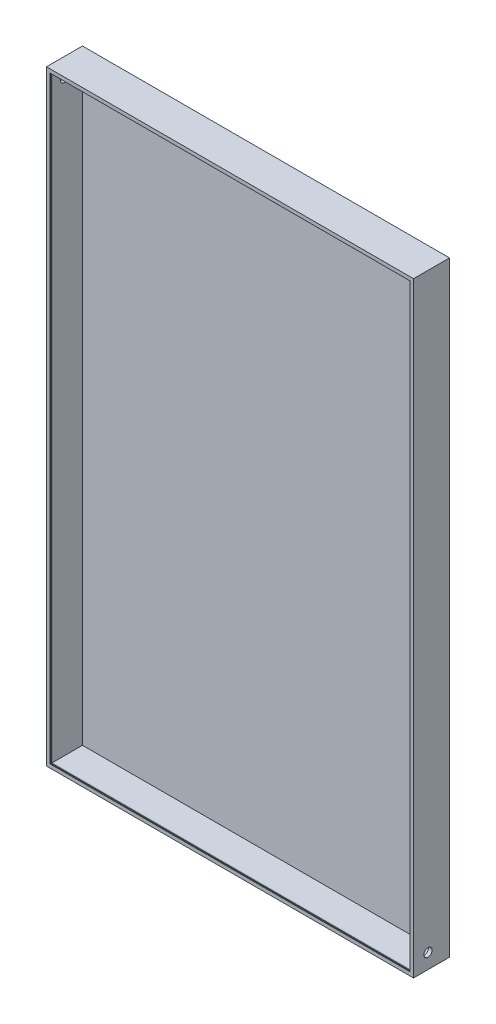
ISO-10303-21;
HEADER;
FILE_DESCRIPTION(('STEP AP214'),'2;1');
FILE_NAME('part.step','',(''),(''),'','','');
FILE_SCHEMA(('AUTOMOTIVE_DESIGN { 1 0 10303 214 1 1 1 1 }'));
ENDSEC;
DATA;
#1=APPLICATION_CONTEXT('core data for automotive mechanical design processes');
#2=APPLICATION_PROTOCOL_DEFINITION('international standard','automotive_design',2000,#1);
#3=PRODUCT_CONTEXT('',#1,'mechanical');
#4=PRODUCT('Part','Part','',(#3));
#5=PRODUCT_RELATED_PRODUCT_CATEGORY('part','',(#4));
#6=PRODUCT_DEFINITION_FORMATION('','',#4);
#7=PRODUCT_DEFINITION_CONTEXT('part definition',#1,'design');
#8=PRODUCT_DEFINITION('design','',#6,#7);
#9=PRODUCT_DEFINITION_SHAPE('','',#8);
#10=(LENGTH_UNIT() NAMED_UNIT(*) SI_UNIT(.MILLI.,.METRE.));
#11=(NAMED_UNIT(*) PLANE_ANGLE_UNIT() SI_UNIT($,.RADIAN.));
#12=(NAMED_UNIT(*) SI_UNIT($,.STERADIAN.) SOLID_ANGLE_UNIT());
#13=UNCERTAINTY_MEASURE_WITH_UNIT(LENGTH_MEASURE(1.E-05),#10,'distance_accuracy_value','');
#14=(GEOMETRIC_REPRESENTATION_CONTEXT(3) GLOBAL_UNCERTAINTY_ASSIGNED_CONTEXT((#13)) GLOBAL_UNIT_ASSIGNED_CONTEXT((#10,
#11,#12)) REPRESENTATION_CONTEXT('',''));
#15=CARTESIAN_POINT('',(0.,0.,0.));
#16=DIRECTION('',(0.,0.,1.));
#17=DIRECTION('',(1.,0.,0.));
#18=AXIS2_PLACEMENT_3D('',#15,#16,#17);
#19=CARTESIAN_POINT('',(0.,0.,100.));
#20=DIRECTION('',(1.,0.,0.));
#21=DIRECTION('',(0.,0.,-1.));
#22=AXIS2_PLACEMENT_3D('',#19,#20,#21);
#23=PLANE('',#22);
#24=CARTESIAN_POINT('',(0.,1631.45,60.));
#25=DIRECTION('',(1.,0.,0.));
#26=DIRECTION('',(0.,0.,-1.));
#27=AXIS2_PLACEMENT_3D('',#24,#25,#26);
#28=CIRCLE('',#27,11.45);
#29=CARTESIAN_POINT('',(0.,1631.45,48.55));
#30=VERTEX_POINT('',#29);
#31=EDGE_CURVE('E226',#30,#30,#28,.F.);
#32=ORIENTED_EDGE('',*,*,#31,.T.);
#33=EDGE_LOOP('',(#32));
#34=FACE_BOUND('',#33,.T.);
#35=DIRECTION('',(0.,0.,-1.));
#36=VECTOR('',#35,1.);
#37=CARTESIAN_POINT('',(0.,1662.9,100.));
#38=LINE('',#37,#36);
#39=CARTESIAN_POINT('',(0.,1662.9,96.));
#40=VERTEX_POINT('',#39);
#41=CARTESIAN_POINT('',(0.,1662.9,10.));
#42=VERTEX_POINT('',#41);
#43=EDGE_CURVE('E243',#40,#42,#38,.T.);
#44=ORIENTED_EDGE('',*,*,#43,.F.);
#45=DIRECTION('',(0.,-1.,0.));
#46=VECTOR('',#45,1.);
#47=CARTESIAN_POINT('',(0.,1662.9,96.));
#48=LINE('',#47,#46);
#49=CARTESIAN_POINT('',(0.,0.,96.));
#50=VERTEX_POINT('',#49);
#51=EDGE_CURVE('E203',#40,#50,#48,.T.);
#52=ORIENTED_EDGE('',*,*,#51,.T.);
#53=DIRECTION('',(0.,0.,-1.));
#54=VECTOR('',#53,1.);
#55=CARTESIAN_POINT('',(0.,0.,100.));
#56=LINE('',#55,#54);
#57=CARTESIAN_POINT('',(0.,0.,10.));
#58=VERTEX_POINT('',#57);
#59=EDGE_CURVE('E252',#50,#58,#56,.T.);
#60=ORIENTED_EDGE('',*,*,#59,.T.);
#61=DIRECTION('',(0.,-1.,0.));
#62=VECTOR('',#61,1.);
#63=CARTESIAN_POINT('',(0.,0.,10.));
#64=LINE('',#63,#62);
#65=EDGE_CURVE('E11',#42,#58,#64,.T.);
#66=ORIENTED_EDGE('',*,*,#65,.F.);
#67=EDGE_LOOP('',(#44,#52,#60,#66));
#68=FACE_BOUND('',#67,.T.);
#69=ADVANCED_FACE('F43',(#34,#68),#23,.T.);
#70=CARTESIAN_POINT('',(1000.,0.,100.));
#71=DIRECTION('',(0.,1.,0.));
#72=DIRECTION('',(0.,0.,1.));
#73=AXIS2_PLACEMENT_3D('',#70,#71,#72);
#74=PLANE('',#73);
#75=ORIENTED_EDGE('',*,*,#59,.F.);
#76=DIRECTION('',(1.,0.,0.));
#77=VECTOR('',#76,1.);
#78=CARTESIAN_POINT('',(0.,0.,96.));
#79=LINE('',#78,#77);
#80=CARTESIAN_POINT('',(1000.,0.,96.));
#81=VERTEX_POINT('',#80);
#82=EDGE_CURVE('E206',#50,#81,#79,.T.);
#83=ORIENTED_EDGE('',*,*,#82,.T.);
#84=DIRECTION('',(0.,0.,-1.));
#85=VECTOR('',#84,1.);
#86=CARTESIAN_POINT('',(1000.,0.,100.));
#87=LINE('',#86,#85);
#88=CARTESIAN_POINT('',(1000.,0.,10.));
#89=VERTEX_POINT('',#88);
#90=EDGE_CURVE('E249',#81,#89,#87,.T.);
#91=ORIENTED_EDGE('',*,*,#90,.T.);
#92=DIRECTION('',(1.,0.,0.));
#93=VECTOR('',#92,1.);
#94=CARTESIAN_POINT('',(0.,0.,10.));
#95=LINE('',#94,#93);
#96=EDGE_CURVE('E285',#58,#89,#95,.T.);
#97=ORIENTED_EDGE('',*,*,#96,.F.);
#98=EDGE_LOOP('',(#75,#83,#91,#97));
#99=FACE_BOUND('',#98,.T.);
#100=ADVANCED_FACE('F304',(#99),#74,.T.);
#101=CARTESIAN_POINT('',(1000.,1662.9,100.));
#102=DIRECTION('',(-1.,0.,0.));
#103=DIRECTION('',(0.,0.,1.));
#104=AXIS2_PLACEMENT_3D('',#101,#102,#103);
#105=PLANE('',#104);
#106=CARTESIAN_POINT('',(1000.,31.47,60.));
#107=DIRECTION('',(1.,0.,0.));
#108=DIRECTION('',(0.,1.,0.));
#109=AXIS2_PLACEMENT_3D('',#106,#107,#108);
#110=CIRCLE('',#109,11.45);
#111=CARTESIAN_POINT('',(1000.,42.92,60.));
#112=VERTEX_POINT('',#111);
#113=EDGE_CURVE('E223',#112,#112,#110,.T.);
#114=ORIENTED_EDGE('',*,*,#113,.T.);
#115=EDGE_LOOP('',(#114));
#116=FACE_BOUND('',#115,.T.);
#117=ORIENTED_EDGE('',*,*,#90,.F.);
#118=DIRECTION('',(0.,1.,0.));
#119=VECTOR('',#118,1.);
#120=CARTESIAN_POINT('',(1000.,1662.9,96.));
#121=LINE('',#120,#119);
#122=CARTESIAN_POINT('',(1000.,1662.9,96.));
#123=VERTEX_POINT('',#122);
#124=EDGE_CURVE('E210',#81,#123,#121,.T.);
#125=ORIENTED_EDGE('',*,*,#124,.T.);
#126=DIRECTION('',(0.,0.,-1.));
#127=VECTOR('',#126,1.);
#128=CARTESIAN_POINT('',(1000.,1662.9,100.));
#129=LINE('',#128,#127);
#130=CARTESIAN_POINT('',(1000.,1662.9,10.));
#131=VERTEX_POINT('',#130);
#132=EDGE_CURVE('E246',#123,#131,#129,.T.);
#133=ORIENTED_EDGE('',*,*,#132,.T.);
#134=DIRECTION('',(0.,1.,0.));
#135=VECTOR('',#134,1.);
#136=CARTESIAN_POINT('',(1000.,0.,10.));
#137=LINE('',#136,#135);
#138=EDGE_CURVE('E288',#89,#131,#137,.T.);
#139=ORIENTED_EDGE('',*,*,#138,.F.);
#140=EDGE_LOOP('',(#117,#125,#133,#139));
#141=FACE_BOUND('',#140,.T.);
#142=ADVANCED_FACE('F307',(#116,#141),#105,.T.);
#143=CARTESIAN_POINT('',(0.,1662.9,100.));
#144=DIRECTION('',(0.,-1.,0.));
#145=DIRECTION('',(0.,0.,-1.));
#146=AXIS2_PLACEMENT_3D('',#143,#144,#145);
#147=PLANE('',#146);
#148=ORIENTED_EDGE('',*,*,#132,.F.);
#149=DIRECTION('',(-1.,0.,0.));
#150=VECTOR('',#149,1.);
#151=CARTESIAN_POINT('',(0.,1662.9,96.));
#152=LINE('',#151,#150);
#153=EDGE_CURVE('E213',#123,#40,#152,.T.);
#154=ORIENTED_EDGE('',*,*,#153,.T.);
#155=ORIENTED_EDGE('',*,*,#43,.T.);
#156=DIRECTION('',(-1.,0.,0.));
#157=VECTOR('',#156,1.);
#158=CARTESIAN_POINT('',(1000.,1662.9,10.));
#159=LINE('',#158,#157);
#160=EDGE_CURVE('E51',#131,#42,#159,.T.);
#161=ORIENTED_EDGE('',*,*,#160,.F.);
#162=EDGE_LOOP('',(#148,#154,#155,#161));
#163=FACE_BOUND('',#162,.T.);
#164=ADVANCED_FACE('F298',(#163),#147,.T.);
#165=CARTESIAN_POINT('',(0.,0.,10.));
#166=DIRECTION('',(0.,0.,1.));
#167=DIRECTION('',(1.,0.,0.));
#168=AXIS2_PLACEMENT_3D('',#165,#166,#167);
#169=PLANE('',#168);
#170=ORIENTED_EDGE('',*,*,#96,.T.);
#171=ORIENTED_EDGE('',*,*,#138,.T.);
#172=ORIENTED_EDGE('',*,*,#160,.T.);
#173=ORIENTED_EDGE('',*,*,#65,.T.);
#174=EDGE_LOOP('',(#170,#171,#172,#173));
#175=FACE_BOUND('',#174,.T.);
#176=ADVANCED_FACE('F293',(#175),#169,.T.);
#177=CARTESIAN_POINT('',(0.,0.,100.));
#178=DIRECTION('',(0.,0.,-1.));
#179=DIRECTION('',(-1.,0.,0.));
#180=AXIS2_PLACEMENT_3D('',#177,#178,#179);
#181=PLANE('',#180);
#182=DIRECTION('',(0.,1.,0.));
#183=VECTOR('',#182,1.);
#184=CARTESIAN_POINT('',(1010.,1672.9,100.));
#185=LINE('',#184,#183);
#186=CARTESIAN_POINT('',(1010.,-9.99999999999999,100.));
#187=VERTEX_POINT('',#186);
#188=CARTESIAN_POINT('',(1010.,1672.9,100.));
#189=VERTEX_POINT('',#188);
#190=EDGE_CURVE('E256',#187,#189,#185,.T.);
#191=ORIENTED_EDGE('',*,*,#190,.T.);
#192=DIRECTION('',(-1.,0.,0.));
#193=VECTOR('',#192,1.);
#194=CARTESIAN_POINT('',(-9.99999999999999,1672.9,100.));
#195=LINE('',#194,#193);
#196=CARTESIAN_POINT('',(-9.99999999999999,1672.9,100.));
#197=VERTEX_POINT('',#196);
#198=EDGE_CURVE('E259',#189,#197,#195,.T.);
#199=ORIENTED_EDGE('',*,*,#198,.T.);
#200=DIRECTION('',(0.,-1.,0.));
#201=VECTOR('',#200,1.);
#202=CARTESIAN_POINT('',(-10.,-10.0000000000001,100.));
#203=LINE('',#202,#201);
#204=CARTESIAN_POINT('',(-10.,-10.0000000000001,100.));
#205=VERTEX_POINT('',#204);
#206=EDGE_CURVE('E262',#197,#205,#203,.T.);
#207=ORIENTED_EDGE('',*,*,#206,.T.);
#208=DIRECTION('',(1.,0.,0.));
#209=VECTOR('',#208,1.);
#210=CARTESIAN_POINT('',(1010.,-9.99999999999999,100.));
#211=LINE('',#210,#209);
#212=EDGE_CURVE('E264',#205,#187,#211,.T.);
#213=ORIENTED_EDGE('',*,*,#212,.T.);
#214=EDGE_LOOP('',(#191,#199,#207,#213));
#215=FACE_BOUND('',#214,.T.);
#216=DIRECTION('',(0.,-1.,0.));
#217=VECTOR('',#216,1.);
#218=CARTESIAN_POINT('',(0.,0.,100.));
#219=LINE('',#218,#217);
#220=CARTESIAN_POINT('',(0.,1662.9,100.));
#221=VERTEX_POINT('',#220);
#222=CARTESIAN_POINT('',(0.,0.,100.));
#223=VERTEX_POINT('',#222);
#224=EDGE_CURVE('E234',#221,#223,#219,.T.);
#225=ORIENTED_EDGE('',*,*,#224,.F.);
#226=DIRECTION('',(-1.,0.,0.));
#227=VECTOR('',#226,1.);
#228=CARTESIAN_POINT('',(0.,1662.9,100.));
#229=LINE('',#228,#227);
#230=CARTESIAN_POINT('',(1000.,1662.9,100.));
#231=VERTEX_POINT('',#230);
#232=EDGE_CURVE('E241',#231,#221,#229,.T.);
#233=ORIENTED_EDGE('',*,*,#232,.F.);
#234=DIRECTION('',(0.,1.,0.));
#235=VECTOR('',#234,1.);
#236=CARTESIAN_POINT('',(1000.,1662.9,100.));
#237=LINE('',#236,#235);
#238=CARTESIAN_POINT('',(1000.,0.,100.));
#239=VERTEX_POINT('',#238);
#240=EDGE_CURVE('E238',#239,#231,#237,.T.);
#241=ORIENTED_EDGE('',*,*,#240,.F.);
#242=DIRECTION('',(1.,0.,0.));
#243=VECTOR('',#242,1.);
#244=CARTESIAN_POINT('',(1000.,0.,100.));
#245=LINE('',#244,#243);
#246=EDGE_CURVE('E236',#223,#239,#245,.T.);
#247=ORIENTED_EDGE('',*,*,#246,.F.);
#248=EDGE_LOOP('',(#225,#233,#241,#247));
#249=FACE_BOUND('',#248,.T.);
#250=ADVANCED_FACE('F353',(#215,#249),#181,.F.);
#251=CARTESIAN_POINT('',(1010.,1672.9,100.));
#252=DIRECTION('',(-1.,0.,0.));
#253=DIRECTION('',(0.,-1.,0.));
#254=AXIS2_PLACEMENT_3D('',#251,#252,#253);
#255=PLANE('',#254);
#256=CARTESIAN_POINT('',(1010.,31.47,60.));
#257=DIRECTION('',(1.,0.,0.));
#258=DIRECTION('',(0.,1.,0.));
#259=AXIS2_PLACEMENT_3D('',#256,#257,#258);
#260=CIRCLE('',#259,11.45);
#261=CARTESIAN_POINT('',(1010.,42.92,60.));
#262=VERTEX_POINT('',#261);
#263=EDGE_CURVE('E216',#262,#262,#260,.T.);
#264=ORIENTED_EDGE('',*,*,#263,.F.);
#265=EDGE_LOOP('',(#264));
#266=FACE_BOUND('',#265,.T.);
#267=DIRECTION('',(0.,1.,0.));
#268=VECTOR('',#267,1.);
#269=CARTESIAN_POINT('',(1010.,1672.9,0.));
#270=LINE('',#269,#268);
#271=CARTESIAN_POINT('',(1010.,-9.99999999999999,0.));
#272=VERTEX_POINT('',#271);
#273=CARTESIAN_POINT('',(1010.,1672.9,0.));
#274=VERTEX_POINT('',#273);
#275=EDGE_CURVE('E255',#272,#274,#270,.T.);
#276=ORIENTED_EDGE('',*,*,#275,.T.);
#277=DIRECTION('',(0.,0.,-1.));
#278=VECTOR('',#277,1.);
#279=CARTESIAN_POINT('',(1010.,1672.9,100.));
#280=LINE('',#279,#278);
#281=EDGE_CURVE('E282',#189,#274,#280,.T.);
#282=ORIENTED_EDGE('',*,*,#281,.F.);
#283=ORIENTED_EDGE('',*,*,#190,.F.);
#284=DIRECTION('',(0.,0.,-1.));
#285=VECTOR('',#284,1.);
#286=CARTESIAN_POINT('',(1010.,-9.99999999999999,100.));
#287=LINE('',#286,#285);
#288=EDGE_CURVE('E266',#187,#272,#287,.T.);
#289=ORIENTED_EDGE('',*,*,#288,.T.);
#290=EDGE_LOOP('',(#276,#282,#283,#289));
#291=FACE_BOUND('',#290,.T.);
#292=ADVANCED_FACE('F355',(#266,#291),#255,.F.);
#293=CARTESIAN_POINT('',(-9.99999999999999,1672.9,100.));
#294=DIRECTION('',(0.,-1.,0.));
#295=DIRECTION('',(0.,0.,-1.));
#296=AXIS2_PLACEMENT_3D('',#293,#294,#295);
#297=PLANE('',#296);
#298=DIRECTION('',(-1.,0.,0.));
#299=VECTOR('',#298,1.);
#300=CARTESIAN_POINT('',(-9.99999999999999,1672.9,0.));
#301=LINE('',#300,#299);
#302=CARTESIAN_POINT('',(-9.99999999999999,1672.9,0.));
#303=VERTEX_POINT('',#302);
#304=EDGE_CURVE('E269',#274,#303,#301,.T.);
#305=ORIENTED_EDGE('',*,*,#304,.T.);
#306=DIRECTION('',(0.,0.,-1.));
#307=VECTOR('',#306,1.);
#308=CARTESIAN_POINT('',(-9.99999999999999,1672.9,100.));
#309=LINE('',#308,#307);
#310=EDGE_CURVE('E279',#197,#303,#309,.T.);
#311=ORIENTED_EDGE('',*,*,#310,.F.);
#312=ORIENTED_EDGE('',*,*,#198,.F.);
#313=ORIENTED_EDGE('',*,*,#281,.T.);
#314=EDGE_LOOP('',(#305,#311,#312,#313));
#315=FACE_BOUND('',#314,.T.);
#316=ADVANCED_FACE('F361',(#315),#297,.F.);
#317=CARTESIAN_POINT('',(-10.,-10.0000000000001,100.));
#318=DIRECTION('',(1.,0.,0.));
#319=DIRECTION('',(0.,1.,0.));
#320=AXIS2_PLACEMENT_3D('',#317,#318,#319);
#321=PLANE('',#320);
#322=CARTESIAN_POINT('',(-9.99999999999999,1631.45,60.));
#323=DIRECTION('',(-1.,0.,0.));
#324=DIRECTION('',(0.,-1.,0.));
#325=AXIS2_PLACEMENT_3D('',#322,#323,#324);
#326=CIRCLE('',#325,11.45);
#327=CARTESIAN_POINT('',(-9.99999999999999,1620.,60.));
#328=VERTEX_POINT('',#327);
#329=EDGE_CURVE('E231',#328,#328,#326,.T.);
#330=ORIENTED_EDGE('',*,*,#329,.F.);
#331=EDGE_LOOP('',(#330));
#332=FACE_BOUND('',#331,.T.);
#333=DIRECTION('',(0.,-1.,0.));
#334=VECTOR('',#333,1.);
#335=CARTESIAN_POINT('',(-10.,-10.0000000000001,0.));
#336=LINE('',#335,#334);
#337=CARTESIAN_POINT('',(-10.,-10.0000000000001,0.));
#338=VERTEX_POINT('',#337);
#339=EDGE_CURVE('E271',#303,#338,#336,.T.);
#340=ORIENTED_EDGE('',*,*,#339,.T.);
#341=DIRECTION('',(0.,0.,-1.));
#342=VECTOR('',#341,1.);
#343=CARTESIAN_POINT('',(-10.,-10.0000000000001,100.));
#344=LINE('',#343,#342);
#345=EDGE_CURVE('E276',#205,#338,#344,.T.);
#346=ORIENTED_EDGE('',*,*,#345,.F.);
#347=ORIENTED_EDGE('',*,*,#206,.F.);
#348=ORIENTED_EDGE('',*,*,#310,.T.);
#349=EDGE_LOOP('',(#340,#346,#347,#348));
#350=FACE_BOUND('',#349,.T.);
#351=ADVANCED_FACE('F340',(#332,#350),#321,.F.);
#352=CARTESIAN_POINT('',(1010.,-9.99999999999999,100.));
#353=DIRECTION('',(0.,1.,0.));
#354=DIRECTION('',(-1.,0.,0.));
#355=AXIS2_PLACEMENT_3D('',#352,#353,#354);
#356=PLANE('',#355);
#357=DIRECTION('',(1.,0.,0.));
#358=VECTOR('',#357,1.);
#359=CARTESIAN_POINT('',(1010.,-9.99999999999999,0.));
#360=LINE('',#359,#358);
#361=EDGE_CURVE('E260',#338,#272,#360,.T.);
#362=ORIENTED_EDGE('',*,*,#361,.T.);
#363=ORIENTED_EDGE('',*,*,#288,.F.);
#364=ORIENTED_EDGE('',*,*,#212,.F.);
#365=ORIENTED_EDGE('',*,*,#345,.T.);
#366=EDGE_LOOP('',(#362,#363,#364,#365));
#367=FACE_BOUND('',#366,.T.);
#368=ADVANCED_FACE('F333',(#367),#356,.F.);
#369=DIRECTION('',(0.,-1.,0.));
#370=VECTOR('',#369,1.);
#371=CARTESIAN_POINT('',(0.,1662.9,98.));
#372=LINE('',#371,#370);
#373=CARTESIAN_POINT('',(0.,1662.9,98.));
#374=VERTEX_POINT('',#373);
#375=CARTESIAN_POINT('',(0.,0.,98.));
#376=VERTEX_POINT('',#375);
#377=EDGE_CURVE('E199',#374,#376,#372,.T.);
#378=ORIENTED_EDGE('',*,*,#377,.F.);
#379=EDGE_CURVE('E244',#221,#374,#38,.T.);
#380=ORIENTED_EDGE('',*,*,#379,.F.);
#381=ORIENTED_EDGE('',*,*,#224,.T.);
#382=EDGE_CURVE('E253',#223,#376,#56,.T.);
#383=ORIENTED_EDGE('',*,*,#382,.T.);
#384=EDGE_LOOP('',(#378,#380,#381,#383));
#385=FACE_BOUND('',#384,.T.);
#386=ADVANCED_FACE('F325',(#385),#23,.T.);
#387=DIRECTION('',(1.,0.,0.));
#388=VECTOR('',#387,1.);
#389=CARTESIAN_POINT('',(0.,0.,98.));
#390=LINE('',#389,#388);
#391=CARTESIAN_POINT('',(1000.,0.,98.));
#392=VERTEX_POINT('',#391);
#393=EDGE_CURVE('E58',#376,#392,#390,.T.);
#394=ORIENTED_EDGE('',*,*,#393,.F.);
#395=ORIENTED_EDGE('',*,*,#382,.F.);
#396=ORIENTED_EDGE('',*,*,#246,.T.);
#397=EDGE_CURVE('E250',#239,#392,#87,.T.);
#398=ORIENTED_EDGE('',*,*,#397,.T.);
#399=EDGE_LOOP('',(#394,#395,#396,#398));
#400=FACE_BOUND('',#399,.T.);
#401=ADVANCED_FACE('F330',(#400),#74,.T.);
#402=DIRECTION('',(0.,1.,0.));
#403=VECTOR('',#402,1.);
#404=CARTESIAN_POINT('',(1000.,1662.9,98.));
#405=LINE('',#404,#403);
#406=CARTESIAN_POINT('',(1000.,1662.9,98.));
#407=VERTEX_POINT('',#406);
#408=EDGE_CURVE('E66',#392,#407,#405,.T.);
#409=ORIENTED_EDGE('',*,*,#408,.F.);
#410=ORIENTED_EDGE('',*,*,#397,.F.);
#411=ORIENTED_EDGE('',*,*,#240,.T.);
#412=EDGE_CURVE('E247',#231,#407,#129,.T.);
#413=ORIENTED_EDGE('',*,*,#412,.T.);
#414=EDGE_LOOP('',(#409,#410,#411,#413));
#415=FACE_BOUND('',#414,.T.);
#416=ADVANCED_FACE('F339',(#415),#105,.T.);
#417=DIRECTION('',(-1.,0.,0.));
#418=VECTOR('',#417,1.);
#419=CARTESIAN_POINT('',(0.,1662.9,98.));
#420=LINE('',#419,#418);
#421=EDGE_CURVE('E207',#407,#374,#420,.T.);
#422=ORIENTED_EDGE('',*,*,#421,.F.);
#423=ORIENTED_EDGE('',*,*,#412,.F.);
#424=ORIENTED_EDGE('',*,*,#232,.T.);
#425=ORIENTED_EDGE('',*,*,#379,.T.);
#426=EDGE_LOOP('',(#422,#423,#424,#425));
#427=FACE_BOUND('',#426,.T.);
#428=ADVANCED_FACE('F348',(#427),#147,.T.);
#429=CARTESIAN_POINT('',(0.,0.,0.));
#430=DIRECTION('',(0.,0.,1.));
#431=DIRECTION('',(1.,0.,0.));
#432=AXIS2_PLACEMENT_3D('',#429,#430,#431);
#433=PLANE('',#432);
#434=ORIENTED_EDGE('',*,*,#275,.F.);
#435=ORIENTED_EDGE('',*,*,#361,.F.);
#436=ORIENTED_EDGE('',*,*,#339,.F.);
#437=ORIENTED_EDGE('',*,*,#304,.F.);
#438=EDGE_LOOP('',(#434,#435,#436,#437));
#439=FACE_BOUND('',#438,.T.);
#440=ADVANCED_FACE('F45',(#439),#433,.F.);
#441=CARTESIAN_POINT('',(1010.001,1631.45,60.));
#442=DIRECTION('',(-1.,0.,0.));
#443=DIRECTION('',(0.,-1.,0.));
#444=AXIS2_PLACEMENT_3D('',#441,#442,#443);
#445=CYLINDRICAL_SURFACE('',#444,11.45);
#446=ORIENTED_EDGE('',*,*,#31,.F.);
#447=EDGE_LOOP('',(#446));
#448=FACE_BOUND('',#447,.T.);
#449=ORIENTED_EDGE('',*,*,#329,.T.);
#450=EDGE_LOOP('',(#449));
#451=FACE_BOUND('',#450,.T.);
#452=ADVANCED_FACE('F318',(#448,#451),#445,.F.);
#453=CARTESIAN_POINT('',(1000.,31.47,60.));
#454=DIRECTION('',(1.,0.,0.));
#455=DIRECTION('',(0.,1.,0.));
#456=AXIS2_PLACEMENT_3D('',#453,#454,#455);
#457=CYLINDRICAL_SURFACE('',#456,11.45);
#458=ORIENTED_EDGE('',*,*,#113,.F.);
#459=EDGE_LOOP('',(#458));
#460=FACE_BOUND('',#459,.T.);
#461=ORIENTED_EDGE('',*,*,#263,.T.);
#462=EDGE_LOOP('',(#461));
#463=FACE_BOUND('',#462,.T.);
#464=ADVANCED_FACE('F310',(#460,#463),#457,.F.);
#465=CARTESIAN_POINT('',(0.,0.,96.));
#466=DIRECTION('',(0.,0.,1.));
#467=DIRECTION('',(1.,0.,0.));
#468=AXIS2_PLACEMENT_3D('',#465,#466,#467);
#469=PLANE('',#468);
#470=DIRECTION('',(-1.,0.,0.));
#471=VECTOR('',#470,1.);
#472=CARTESIAN_POINT('',(2.,1660.9,96.));
#473=LINE('',#472,#471);
#474=CARTESIAN_POINT('',(998.,1660.9,96.));
#475=VERTEX_POINT('',#474);
#476=CARTESIAN_POINT('',(2.,1660.9,96.));
#477=VERTEX_POINT('',#476);
#478=EDGE_CURVE('E171',#475,#477,#473,.T.);
#479=ORIENTED_EDGE('',*,*,#478,.T.);
#480=DIRECTION('',(0.,-1.,0.));
#481=VECTOR('',#480,1.);
#482=CARTESIAN_POINT('',(2.,1660.9,96.));
#483=LINE('',#482,#481);
#484=CARTESIAN_POINT('',(2.00000000000021,2.,96.));
#485=VERTEX_POINT('',#484);
#486=EDGE_CURVE('E163',#477,#485,#483,.T.);
#487=ORIENTED_EDGE('',*,*,#486,.T.);
#488=DIRECTION('',(1.,0.,0.));
#489=VECTOR('',#488,1.);
#490=CARTESIAN_POINT('',(2.00000000000021,2.,96.));
#491=LINE('',#490,#489);
#492=CARTESIAN_POINT('',(998.,2.,96.));
#493=VERTEX_POINT('',#492);
#494=EDGE_CURVE('E175',#485,#493,#491,.T.);
#495=ORIENTED_EDGE('',*,*,#494,.T.);
#496=DIRECTION('',(0.,1.,0.));
#497=VECTOR('',#496,1.);
#498=CARTESIAN_POINT('',(998.,1660.9,96.));
#499=LINE('',#498,#497);
#500=EDGE_CURVE('E179',#493,#475,#499,.T.);
#501=ORIENTED_EDGE('',*,*,#500,.T.);
#502=EDGE_LOOP('',(#479,#487,#495,#501));
#503=FACE_BOUND('',#502,.T.);
#504=ORIENTED_EDGE('',*,*,#51,.F.);
#505=ORIENTED_EDGE('',*,*,#153,.F.);
#506=ORIENTED_EDGE('',*,*,#124,.F.);
#507=ORIENTED_EDGE('',*,*,#82,.F.);
#508=EDGE_LOOP('',(#504,#505,#506,#507));
#509=FACE_BOUND('',#508,.T.);
#510=ADVANCED_FACE('F181',(#503,#509),#469,.F.);
#511=CARTESIAN_POINT('',(0.,0.,98.));
#512=DIRECTION('',(0.,0.,1.));
#513=DIRECTION('',(1.,0.,0.));
#514=AXIS2_PLACEMENT_3D('',#511,#512,#513);
#515=PLANE('',#514);
#516=DIRECTION('',(0.,-1.,0.));
#517=VECTOR('',#516,1.);
#518=CARTESIAN_POINT('',(2.,1660.9,98.));
#519=LINE('',#518,#517);
#520=CARTESIAN_POINT('',(2.,1660.9,98.));
#521=VERTEX_POINT('',#520);
#522=CARTESIAN_POINT('',(2.00000000000021,2.,98.));
#523=VERTEX_POINT('',#522);
#524=EDGE_CURVE('E166',#521,#523,#519,.T.);
#525=ORIENTED_EDGE('',*,*,#524,.F.);
#526=DIRECTION('',(-1.,0.,0.));
#527=VECTOR('',#526,1.);
#528=CARTESIAN_POINT('',(2.,1660.9,98.));
#529=LINE('',#528,#527);
#530=CARTESIAN_POINT('',(998.,1660.9,98.));
#531=VERTEX_POINT('',#530);
#532=EDGE_CURVE('E184',#531,#521,#529,.T.);
#533=ORIENTED_EDGE('',*,*,#532,.F.);
#534=DIRECTION('',(0.,1.,0.));
#535=VECTOR('',#534,1.);
#536=CARTESIAN_POINT('',(998.,1660.9,98.));
#537=LINE('',#536,#535);
#538=CARTESIAN_POINT('',(998.,2.,98.));
#539=VERTEX_POINT('',#538);
#540=EDGE_CURVE('E187',#539,#531,#537,.T.);
#541=ORIENTED_EDGE('',*,*,#540,.F.);
#542=DIRECTION('',(1.,0.,0.));
#543=VECTOR('',#542,1.);
#544=CARTESIAN_POINT('',(2.00000000000021,2.,98.));
#545=LINE('',#544,#543);
#546=EDGE_CURVE('E193',#523,#539,#545,.T.);
#547=ORIENTED_EDGE('',*,*,#546,.F.);
#548=EDGE_LOOP('',(#525,#533,#541,#547));
#549=FACE_BOUND('',#548,.T.);
#550=ORIENTED_EDGE('',*,*,#377,.T.);
#551=ORIENTED_EDGE('',*,*,#393,.T.);
#552=ORIENTED_EDGE('',*,*,#408,.T.);
#553=ORIENTED_EDGE('',*,*,#421,.T.);
#554=EDGE_LOOP('',(#550,#551,#552,#553));
#555=FACE_BOUND('',#554,.T.);
#556=ADVANCED_FACE('F309',(#549,#555),#515,.T.);
#557=CARTESIAN_POINT('',(2.,1660.9,96.));
#558=DIRECTION('',(-1.,0.,0.));
#559=DIRECTION('',(0.,-1.,0.));
#560=AXIS2_PLACEMENT_3D('',#557,#558,#559);
#561=PLANE('',#560);
#562=ORIENTED_EDGE('',*,*,#524,.T.);
#563=DIRECTION('',(0.,0.,1.));
#564=VECTOR('',#563,1.);
#565=CARTESIAN_POINT('',(2.00000000000021,2.,96.));
#566=LINE('',#565,#564);
#567=EDGE_CURVE('E159',#485,#523,#566,.T.);
#568=ORIENTED_EDGE('',*,*,#567,.F.);
#569=ORIENTED_EDGE('',*,*,#486,.F.);
#570=DIRECTION('',(0.,0.,1.));
#571=VECTOR('',#570,1.);
#572=CARTESIAN_POINT('',(2.,1660.9,96.));
#573=LINE('',#572,#571);
#574=EDGE_CURVE('E197',#477,#521,#573,.T.);
#575=ORIENTED_EDGE('',*,*,#574,.T.);
#576=EDGE_LOOP('',(#562,#568,#569,#575));
#577=FACE_BOUND('',#576,.T.);
#578=ADVANCED_FACE('F161',(#577),#561,.F.);
#579=CARTESIAN_POINT('',(2.,1660.9,96.));
#580=DIRECTION('',(0.,1.,0.));
#581=DIRECTION('',(0.,0.,1.));
#582=AXIS2_PLACEMENT_3D('',#579,#580,#581);
#583=PLANE('',#582);
#584=ORIENTED_EDGE('',*,*,#532,.T.);
#585=ORIENTED_EDGE('',*,*,#574,.F.);
#586=ORIENTED_EDGE('',*,*,#478,.F.);
#587=DIRECTION('',(0.,0.,1.));
#588=VECTOR('',#587,1.);
#589=CARTESIAN_POINT('',(998.,1660.9,96.));
#590=LINE('',#589,#588);
#591=EDGE_CURVE('E200',#475,#531,#590,.T.);
#592=ORIENTED_EDGE('',*,*,#591,.T.);
#593=EDGE_LOOP('',(#584,#585,#586,#592));
#594=FACE_BOUND('',#593,.T.);
#595=ADVANCED_FACE('F469',(#594),#583,.F.);
#596=CARTESIAN_POINT('',(998.,1660.9,96.));
#597=DIRECTION('',(1.,0.,0.));
#598=DIRECTION('',(0.,1.,0.));
#599=AXIS2_PLACEMENT_3D('',#596,#597,#598);
#600=PLANE('',#599);
#601=ORIENTED_EDGE('',*,*,#540,.T.);
#602=ORIENTED_EDGE('',*,*,#591,.F.);
#603=ORIENTED_EDGE('',*,*,#500,.F.);
#604=DIRECTION('',(0.,0.,1.));
#605=VECTOR('',#604,1.);
#606=CARTESIAN_POINT('',(998.,2.,96.));
#607=LINE('',#606,#605);
#608=EDGE_CURVE('E170',#493,#539,#607,.T.);
#609=ORIENTED_EDGE('',*,*,#608,.T.);
#610=EDGE_LOOP('',(#601,#602,#603,#609));
#611=FACE_BOUND('',#610,.T.);
#612=ADVANCED_FACE('F476',(#611),#600,.F.);
#613=CARTESIAN_POINT('',(2.00000000000021,2.,96.));
#614=DIRECTION('',(0.,-1.,0.));
#615=DIRECTION('',(1.,0.,0.));
#616=AXIS2_PLACEMENT_3D('',#613,#614,#615);
#617=PLANE('',#616);
#618=ORIENTED_EDGE('',*,*,#546,.T.);
#619=ORIENTED_EDGE('',*,*,#608,.F.);
#620=ORIENTED_EDGE('',*,*,#494,.F.);
#621=ORIENTED_EDGE('',*,*,#567,.T.);
#622=EDGE_LOOP('',(#618,#619,#620,#621));
#623=FACE_BOUND('',#622,.T.);
#624=ADVANCED_FACE('F176',(#623),#617,.F.);
#625=CLOSED_SHELL('',(#69,#100,#142,#164,#176,#250,#292,#316,#351,#368,#386,#401,#416,#428,#440,
#452,#464,#510,#556,#578,#595,#612,#624));
#626=MANIFOLD_SOLID_BREP('B2',#625);
#627=ADVANCED_BREP_SHAPE_REPRESENTATION('',(#18,#626),#14);
#628=SHAPE_DEFINITION_REPRESENTATION(#9,#627);
ENDSEC;
END-ISO-10303-21;
